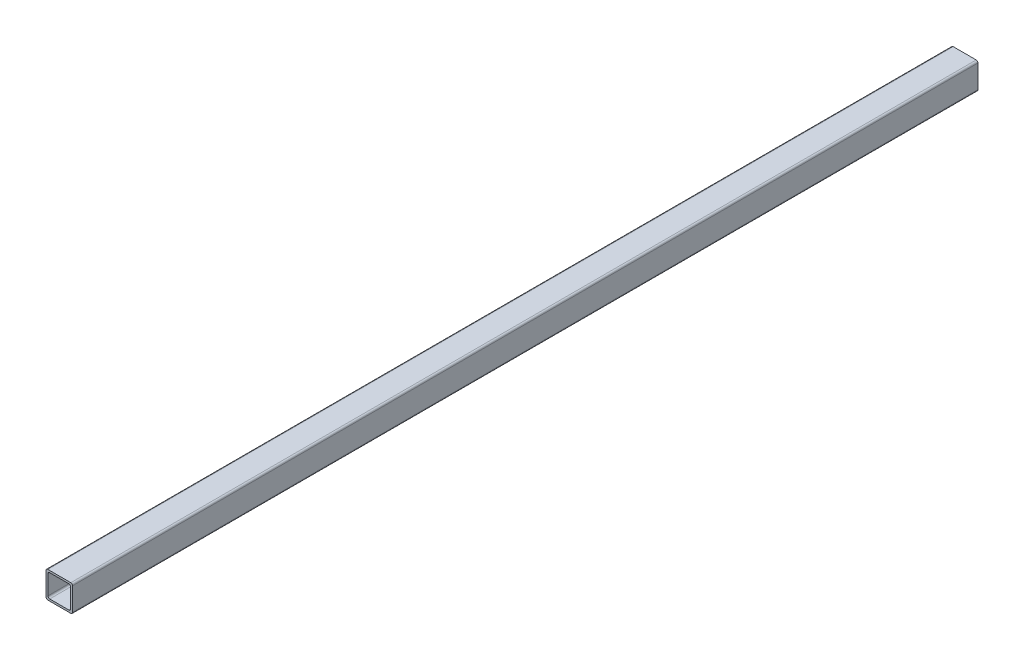
ISO-10303-21;
HEADER;
FILE_DESCRIPTION(('STEP AP214'),'2;1');
FILE_NAME('part.step','',(''),(''),'','','');
FILE_SCHEMA(('AUTOMOTIVE_DESIGN { 1 0 10303 214 1 1 1 1 }'));
ENDSEC;
DATA;
#1=APPLICATION_CONTEXT('core data for automotive mechanical design processes');
#2=APPLICATION_PROTOCOL_DEFINITION('international standard','automotive_design',2000,#1);
#3=PRODUCT_CONTEXT('',#1,'mechanical');
#4=PRODUCT('Part','Part','',(#3));
#5=PRODUCT_RELATED_PRODUCT_CATEGORY('part','',(#4));
#6=PRODUCT_DEFINITION_FORMATION('','',#4);
#7=PRODUCT_DEFINITION_CONTEXT('part definition',#1,'design');
#8=PRODUCT_DEFINITION('design','',#6,#7);
#9=PRODUCT_DEFINITION_SHAPE('','',#8);
#10=(LENGTH_UNIT() NAMED_UNIT(*) SI_UNIT(.MILLI.,.METRE.));
#11=(NAMED_UNIT(*) PLANE_ANGLE_UNIT() SI_UNIT($,.RADIAN.));
#12=(NAMED_UNIT(*) SI_UNIT($,.STERADIAN.) SOLID_ANGLE_UNIT());
#13=UNCERTAINTY_MEASURE_WITH_UNIT(LENGTH_MEASURE(1.E-05),#10,'distance_accuracy_value','');
#14=(GEOMETRIC_REPRESENTATION_CONTEXT(3) GLOBAL_UNCERTAINTY_ASSIGNED_CONTEXT((#13)) GLOBAL_UNIT_ASSIGNED_CONTEXT((#10,
#11,#12)) REPRESENTATION_CONTEXT('',''));
#15=CARTESIAN_POINT('',(0.,0.,0.));
#16=DIRECTION('',(0.,0.,1.));
#17=DIRECTION('',(1.,0.,0.));
#18=AXIS2_PLACEMENT_3D('',#15,#16,#17);
#19=CARTESIAN_POINT('',(2.54,-35.56,0.));
#20=DIRECTION('',(0.,0.,1.));
#21=DIRECTION('',(1.,0.,0.));
#22=AXIS2_PLACEMENT_3D('',#19,#20,#21);
#23=PLANE('',#22);
#24=CARTESIAN_POINT('',(2.54,-35.56,0.));
#25=DIRECTION('',(0.,0.,1.));
#26=DIRECTION('',(1.,0.,0.));
#27=AXIS2_PLACEMENT_3D('',#24,#25,#26);
#28=CIRCLE('',#27,2.54);
#29=CARTESIAN_POINT('',(0.,-35.56,0.));
#30=VERTEX_POINT('',#29);
#31=CARTESIAN_POINT('',(2.54000000000002,-38.1,0.));
#32=VERTEX_POINT('',#31);
#33=EDGE_CURVE('E194',#30,#32,#28,.T.);
#34=ORIENTED_EDGE('',*,*,#33,.F.);
#35=DIRECTION('',(0.,-1.,0.));
#36=VECTOR('',#35,1.);
#37=CARTESIAN_POINT('',(0.,-2.54000000000002,0.));
#38=LINE('',#37,#36);
#39=CARTESIAN_POINT('',(0.,-2.54000000000002,0.));
#40=VERTEX_POINT('',#39);
#41=EDGE_CURVE('E217',#40,#30,#38,.T.);
#42=ORIENTED_EDGE('',*,*,#41,.F.);
#43=CARTESIAN_POINT('',(2.54,-2.54,0.));
#44=DIRECTION('',(0.,0.,1.));
#45=DIRECTION('',(-1.,0.,0.));
#46=AXIS2_PLACEMENT_3D('',#43,#44,#45);
#47=CIRCLE('',#46,2.54);
#48=CARTESIAN_POINT('',(2.54000000000002,0.,0.));
#49=VERTEX_POINT('',#48);
#50=EDGE_CURVE('E214',#49,#40,#47,.T.);
#51=ORIENTED_EDGE('',*,*,#50,.F.);
#52=DIRECTION('',(-1.,0.,0.));
#53=VECTOR('',#52,1.);
#54=CARTESIAN_POINT('',(2.54000000000002,0.,0.));
#55=LINE('',#54,#53);
#56=CARTESIAN_POINT('',(35.56,0.,0.));
#57=VERTEX_POINT('',#56);
#58=EDGE_CURVE('E211',#57,#49,#55,.T.);
#59=ORIENTED_EDGE('',*,*,#58,.F.);
#60=CARTESIAN_POINT('',(35.56,-2.54,0.));
#61=DIRECTION('',(0.,0.,1.));
#62=DIRECTION('',(1.,0.,0.));
#63=AXIS2_PLACEMENT_3D('',#60,#61,#62);
#64=CIRCLE('',#63,2.54);
#65=CARTESIAN_POINT('',(38.1,-2.54000000000002,0.));
#66=VERTEX_POINT('',#65);
#67=EDGE_CURVE('E209',#66,#57,#64,.T.);
#68=ORIENTED_EDGE('',*,*,#67,.F.);
#69=DIRECTION('',(0.,1.,0.));
#70=VECTOR('',#69,1.);
#71=CARTESIAN_POINT('',(38.1,-2.54000000000002,0.));
#72=LINE('',#71,#70);
#73=CARTESIAN_POINT('',(38.1,-35.56,0.));
#74=VERTEX_POINT('',#73);
#75=EDGE_CURVE('E167',#74,#66,#72,.T.);
#76=ORIENTED_EDGE('',*,*,#75,.F.);
#77=CARTESIAN_POINT('',(35.56,-35.56,0.));
#78=DIRECTION('',(0.,0.,1.));
#79=DIRECTION('',(-1.,0.,0.));
#80=AXIS2_PLACEMENT_3D('',#77,#78,#79);
#81=CIRCLE('',#80,2.54);
#82=CARTESIAN_POINT('',(35.56,-38.1,0.));
#83=VERTEX_POINT('',#82);
#84=EDGE_CURVE('E196',#83,#74,#81,.T.);
#85=ORIENTED_EDGE('',*,*,#84,.F.);
#86=DIRECTION('',(1.,0.,0.));
#87=VECTOR('',#86,1.);
#88=CARTESIAN_POINT('',(2.54000000000002,-38.1,0.));
#89=LINE('',#88,#87);
#90=EDGE_CURVE('E184',#32,#83,#89,.T.);
#91=ORIENTED_EDGE('',*,*,#90,.F.);
#92=EDGE_LOOP('',(#34,#42,#51,#59,#68,#76,#85,#91));
#93=FACE_BOUND('',#92,.T.);
#94=CARTESIAN_POINT('',(5.3086,-32.7914,0.));
#95=DIRECTION('',(0.,0.,1.));
#96=DIRECTION('',(1.,0.,0.));
#97=AXIS2_PLACEMENT_3D('',#94,#95,#96);
#98=CIRCLE('',#97,2.54);
#99=CARTESIAN_POINT('',(2.7686,-32.7914,0.));
#100=VERTEX_POINT('',#99);
#101=CARTESIAN_POINT('',(5.30860000000002,-35.3314,0.));
#102=VERTEX_POINT('',#101);
#103=EDGE_CURVE('E242',#100,#102,#98,.T.);
#104=ORIENTED_EDGE('',*,*,#103,.T.);
#105=DIRECTION('',(1.,0.,0.));
#106=VECTOR('',#105,1.);
#107=CARTESIAN_POINT('',(5.30860000000002,-35.3314,0.));
#108=LINE('',#107,#106);
#109=CARTESIAN_POINT('',(32.7914,-35.3314,0.));
#110=VERTEX_POINT('',#109);
#111=EDGE_CURVE('E245',#102,#110,#108,.T.);
#112=ORIENTED_EDGE('',*,*,#111,.T.);
#113=CARTESIAN_POINT('',(32.7914,-32.7914,0.));
#114=DIRECTION('',(0.,0.,1.));
#115=DIRECTION('',(1.,0.,0.));
#116=AXIS2_PLACEMENT_3D('',#113,#114,#115);
#117=CIRCLE('',#116,2.54);
#118=CARTESIAN_POINT('',(35.3314,-32.7914,0.));
#119=VERTEX_POINT('',#118);
#120=EDGE_CURVE('E248',#110,#119,#117,.T.);
#121=ORIENTED_EDGE('',*,*,#120,.T.);
#122=DIRECTION('',(0.,1.,0.));
#123=VECTOR('',#122,1.);
#124=CARTESIAN_POINT('',(35.3314,-5.30860000000002,0.));
#125=LINE('',#124,#123);
#126=CARTESIAN_POINT('',(35.3314,-5.30860000000002,0.));
#127=VERTEX_POINT('',#126);
#128=EDGE_CURVE('E251',#119,#127,#125,.T.);
#129=ORIENTED_EDGE('',*,*,#128,.T.);
#130=CARTESIAN_POINT('',(32.7914,-5.3086,0.));
#131=DIRECTION('',(0.,0.,1.));
#132=DIRECTION('',(1.,0.,0.));
#133=AXIS2_PLACEMENT_3D('',#130,#131,#132);
#134=CIRCLE('',#133,2.54);
#135=CARTESIAN_POINT('',(32.7914,-2.7686,0.));
#136=VERTEX_POINT('',#135);
#137=EDGE_CURVE('E254',#127,#136,#134,.T.);
#138=ORIENTED_EDGE('',*,*,#137,.T.);
#139=DIRECTION('',(-1.,0.,0.));
#140=VECTOR('',#139,1.);
#141=CARTESIAN_POINT('',(5.30860000000002,-2.7686,0.));
#142=LINE('',#141,#140);
#143=CARTESIAN_POINT('',(5.30860000000002,-2.7686,0.));
#144=VERTEX_POINT('',#143);
#145=EDGE_CURVE('E257',#136,#144,#142,.T.);
#146=ORIENTED_EDGE('',*,*,#145,.T.);
#147=CARTESIAN_POINT('',(5.3086,-5.3086,0.));
#148=DIRECTION('',(0.,0.,1.));
#149=DIRECTION('',(1.,0.,0.));
#150=AXIS2_PLACEMENT_3D('',#147,#148,#149);
#151=CIRCLE('',#150,2.54);
#152=CARTESIAN_POINT('',(2.7686,-5.30860000000002,0.));
#153=VERTEX_POINT('',#152);
#154=EDGE_CURVE('E260',#144,#153,#151,.T.);
#155=ORIENTED_EDGE('',*,*,#154,.T.);
#156=DIRECTION('',(0.,-1.,0.));
#157=VECTOR('',#156,1.);
#158=CARTESIAN_POINT('',(2.7686,-5.30860000000002,0.));
#159=LINE('',#158,#157);
#160=EDGE_CURVE('E263',#153,#100,#159,.T.);
#161=ORIENTED_EDGE('',*,*,#160,.T.);
#162=EDGE_LOOP('',(#104,#112,#121,#129,#138,#146,#155,#161));
#163=FACE_BOUND('',#162,.T.);
#164=ADVANCED_FACE('F33',(#93,#163),#23,.F.);
#165=CARTESIAN_POINT('',(2.54,-35.56,1500.));
#166=DIRECTION('',(0.,0.,-1.));
#167=DIRECTION('',(-1.,0.,0.));
#168=AXIS2_PLACEMENT_3D('',#165,#166,#167);
#169=CYLINDRICAL_SURFACE('',#168,2.54);
#170=DIRECTION('',(0.,0.,-1.));
#171=VECTOR('',#170,1.);
#172=CARTESIAN_POINT('',(2.54000000000002,-38.1,1500.));
#173=LINE('',#172,#171);
#174=CARTESIAN_POINT('',(2.54000000000002,-38.1,1296.93567774538));
#175=VERTEX_POINT('',#174);
#176=EDGE_CURVE('E41',#175,#32,#173,.T.);
#177=ORIENTED_EDGE('',*,*,#176,.F.);
#178=CARTESIAN_POINT('',(2.54,-35.56,1296.93567774538));
#179=DIRECTION('',(0.,0.,-1.));
#180=DIRECTION('',(0.,1.,0.));
#181=AXIS2_PLACEMENT_3D('',#178,#179,#180);
#182=CIRCLE('',#181,2.54);
#183=CARTESIAN_POINT('',(0.,-35.56,1296.93567774538));
#184=VERTEX_POINT('',#183);
#185=EDGE_CURVE('E162',#175,#184,#182,.T.);
#186=ORIENTED_EDGE('',*,*,#185,.T.);
#187=DIRECTION('',(0.,0.,-1.));
#188=VECTOR('',#187,1.);
#189=CARTESIAN_POINT('',(0.,-35.56,1500.));
#190=LINE('',#189,#188);
#191=EDGE_CURVE('E199',#184,#30,#190,.T.);
#192=ORIENTED_EDGE('',*,*,#191,.T.);
#193=ORIENTED_EDGE('',*,*,#33,.T.);
#194=EDGE_LOOP('',(#177,#186,#192,#193));
#195=FACE_BOUND('',#194,.T.);
#196=ADVANCED_FACE('F35',(#195),#169,.T.);
#197=CARTESIAN_POINT('',(2.54000000000002,-38.1,1500.));
#198=DIRECTION('',(0.,1.,0.));
#199=DIRECTION('',(0.,0.,1.));
#200=AXIS2_PLACEMENT_3D('',#197,#198,#199);
#201=PLANE('',#200);
#202=DIRECTION('',(0.,0.,-1.));
#203=VECTOR('',#202,1.);
#204=CARTESIAN_POINT('',(35.56,-38.1,1500.));
#205=LINE('',#204,#203);
#206=CARTESIAN_POINT('',(35.56,-38.1,1296.93567774538));
#207=VERTEX_POINT('',#206);
#208=EDGE_CURVE('E171',#207,#83,#205,.T.);
#209=ORIENTED_EDGE('',*,*,#208,.F.);
#210=DIRECTION('',(-1.,0.,0.));
#211=VECTOR('',#210,1.);
#212=CARTESIAN_POINT('',(2.54000000000002,-38.1,1296.93567774538));
#213=LINE('',#212,#211);
#214=EDGE_CURVE('E186',#207,#175,#213,.T.);
#215=ORIENTED_EDGE('',*,*,#214,.T.);
#216=ORIENTED_EDGE('',*,*,#176,.T.);
#217=ORIENTED_EDGE('',*,*,#90,.T.);
#218=EDGE_LOOP('',(#209,#215,#216,#217));
#219=FACE_BOUND('',#218,.T.);
#220=ADVANCED_FACE('F183',(#219),#201,.F.);
#221=CARTESIAN_POINT('',(35.56,-35.56,1500.));
#222=DIRECTION('',(0.,0.,-1.));
#223=DIRECTION('',(-1.,0.,0.));
#224=AXIS2_PLACEMENT_3D('',#221,#222,#223);
#225=CYLINDRICAL_SURFACE('',#224,2.54);
#226=DIRECTION('',(0.,0.,-1.));
#227=VECTOR('',#226,1.);
#228=CARTESIAN_POINT('',(38.1,-35.56,1500.));
#229=LINE('',#228,#227);
#230=CARTESIAN_POINT('',(38.1,-35.56,1296.93567774538));
#231=VERTEX_POINT('',#230);
#232=EDGE_CURVE('E169',#231,#74,#229,.T.);
#233=ORIENTED_EDGE('',*,*,#232,.F.);
#234=CARTESIAN_POINT('',(35.56,-35.56,1296.93567774538));
#235=DIRECTION('',(0.,0.,-1.));
#236=DIRECTION('',(0.,1.,0.));
#237=AXIS2_PLACEMENT_3D('',#234,#235,#236);
#238=CIRCLE('',#237,2.54);
#239=EDGE_CURVE('E149',#231,#207,#238,.T.);
#240=ORIENTED_EDGE('',*,*,#239,.T.);
#241=ORIENTED_EDGE('',*,*,#208,.T.);
#242=ORIENTED_EDGE('',*,*,#84,.T.);
#243=EDGE_LOOP('',(#233,#240,#241,#242));
#244=FACE_BOUND('',#243,.T.);
#245=ADVANCED_FACE('F351',(#244),#225,.T.);
#246=CARTESIAN_POINT('',(38.1,-2.54000000000002,1500.));
#247=DIRECTION('',(-1.,0.,0.));
#248=DIRECTION('',(0.,-1.,0.));
#249=AXIS2_PLACEMENT_3D('',#246,#247,#248);
#250=PLANE('',#249);
#251=DIRECTION('',(0.,0.,-1.));
#252=VECTOR('',#251,1.);
#253=CARTESIAN_POINT('',(38.1,-2.54000000000002,1500.));
#254=LINE('',#253,#252);
#255=CARTESIAN_POINT('',(38.1,-2.53999999999999,1296.93567774538));
#256=VERTEX_POINT('',#255);
#257=EDGE_CURVE('E159',#256,#66,#254,.T.);
#258=ORIENTED_EDGE('',*,*,#257,.F.);
#259=DIRECTION('',(0.,-1.,0.));
#260=VECTOR('',#259,1.);
#261=CARTESIAN_POINT('',(38.0999999999999,791.741511996223,1296.93567774538));
#262=LINE('',#261,#260);
#263=EDGE_CURVE('E143',#256,#231,#262,.T.);
#264=ORIENTED_EDGE('',*,*,#263,.T.);
#265=ORIENTED_EDGE('',*,*,#232,.T.);
#266=ORIENTED_EDGE('',*,*,#75,.T.);
#267=EDGE_LOOP('',(#258,#264,#265,#266));
#268=FACE_BOUND('',#267,.T.);
#269=ADVANCED_FACE('F165',(#268),#250,.F.);
#270=CARTESIAN_POINT('',(35.56,-2.54,1500.));
#271=DIRECTION('',(0.,0.,-1.));
#272=DIRECTION('',(-1.,0.,0.));
#273=AXIS2_PLACEMENT_3D('',#270,#271,#272);
#274=CYLINDRICAL_SURFACE('',#273,2.54);
#275=DIRECTION('',(0.,0.,-1.));
#276=VECTOR('',#275,1.);
#277=CARTESIAN_POINT('',(35.56,0.,1500.));
#278=LINE('',#277,#276);
#279=CARTESIAN_POINT('',(35.56,0.,1296.93567774538));
#280=VERTEX_POINT('',#279);
#281=EDGE_CURVE('E161',#280,#57,#278,.T.);
#282=ORIENTED_EDGE('',*,*,#281,.F.);
#283=CARTESIAN_POINT('',(35.56,-2.54,1296.93567774538));
#284=DIRECTION('',(0.,0.,-1.));
#285=DIRECTION('',(0.,1.,0.));
#286=AXIS2_PLACEMENT_3D('',#283,#284,#285);
#287=CIRCLE('',#286,2.54);
#288=EDGE_CURVE('E146',#280,#256,#287,.T.);
#289=ORIENTED_EDGE('',*,*,#288,.T.);
#290=ORIENTED_EDGE('',*,*,#257,.T.);
#291=ORIENTED_EDGE('',*,*,#67,.T.);
#292=EDGE_LOOP('',(#282,#289,#290,#291));
#293=FACE_BOUND('',#292,.T.);
#294=ADVANCED_FACE('F157',(#293),#274,.T.);
#295=CARTESIAN_POINT('',(2.54000000000002,0.,1500.));
#296=DIRECTION('',(0.,-1.,0.));
#297=DIRECTION('',(0.,0.,-1.));
#298=AXIS2_PLACEMENT_3D('',#295,#296,#297);
#299=PLANE('',#298);
#300=DIRECTION('',(0.,0.,-1.));
#301=VECTOR('',#300,1.);
#302=CARTESIAN_POINT('',(2.54000000000002,0.,1500.));
#303=LINE('',#302,#301);
#304=CARTESIAN_POINT('',(2.54,0.,1296.93567774538));
#305=VERTEX_POINT('',#304);
#306=EDGE_CURVE('E173',#305,#49,#303,.T.);
#307=ORIENTED_EDGE('',*,*,#306,.F.);
#308=DIRECTION('',(1.,0.,0.));
#309=VECTOR('',#308,1.);
#310=CARTESIAN_POINT('',(2.54000000000002,0.,1296.93567774538));
#311=LINE('',#310,#309);
#312=EDGE_CURVE('E163',#305,#280,#311,.T.);
#313=ORIENTED_EDGE('',*,*,#312,.T.);
#314=ORIENTED_EDGE('',*,*,#281,.T.);
#315=ORIENTED_EDGE('',*,*,#58,.T.);
#316=EDGE_LOOP('',(#307,#313,#314,#315));
#317=FACE_BOUND('',#316,.T.);
#318=ADVANCED_FACE('F228',(#317),#299,.F.);
#319=CARTESIAN_POINT('',(2.54,-2.54,1500.));
#320=DIRECTION('',(0.,0.,-1.));
#321=DIRECTION('',(-1.,0.,0.));
#322=AXIS2_PLACEMENT_3D('',#319,#320,#321);
#323=CYLINDRICAL_SURFACE('',#322,2.54);
#324=DIRECTION('',(0.,0.,-1.));
#325=VECTOR('',#324,1.);
#326=CARTESIAN_POINT('',(0.,-2.54000000000002,1500.));
#327=LINE('',#326,#325);
#328=CARTESIAN_POINT('',(0.,-2.54000000000002,1296.93567774538));
#329=VERTEX_POINT('',#328);
#330=EDGE_CURVE('E220',#329,#40,#327,.T.);
#331=ORIENTED_EDGE('',*,*,#330,.F.);
#332=CARTESIAN_POINT('',(2.54,-2.54,1296.93567774538));
#333=DIRECTION('',(0.,0.,-1.));
#334=DIRECTION('',(0.,1.,0.));
#335=AXIS2_PLACEMENT_3D('',#332,#333,#334);
#336=CIRCLE('',#335,2.54);
#337=EDGE_CURVE('E48',#329,#305,#336,.T.);
#338=ORIENTED_EDGE('',*,*,#337,.T.);
#339=ORIENTED_EDGE('',*,*,#306,.T.);
#340=ORIENTED_EDGE('',*,*,#50,.T.);
#341=EDGE_LOOP('',(#331,#338,#339,#340));
#342=FACE_BOUND('',#341,.T.);
#343=ADVANCED_FACE('F224',(#342),#323,.T.);
#344=CARTESIAN_POINT('',(0.,-2.54000000000002,1500.));
#345=DIRECTION('',(1.,0.,0.));
#346=DIRECTION('',(0.,1.,0.));
#347=AXIS2_PLACEMENT_3D('',#344,#345,#346);
#348=PLANE('',#347);
#349=ORIENTED_EDGE('',*,*,#191,.F.);
#350=DIRECTION('',(0.,1.,0.));
#351=VECTOR('',#350,1.);
#352=CARTESIAN_POINT('',(0.,-2.54000000000004,1296.93567774538));
#353=LINE('',#352,#351);
#354=EDGE_CURVE('E231',#184,#329,#353,.T.);
#355=ORIENTED_EDGE('',*,*,#354,.T.);
#356=ORIENTED_EDGE('',*,*,#330,.T.);
#357=ORIENTED_EDGE('',*,*,#41,.T.);
#358=EDGE_LOOP('',(#349,#355,#356,#357));
#359=FACE_BOUND('',#358,.T.);
#360=ADVANCED_FACE('F230',(#359),#348,.F.);
#361=CARTESIAN_POINT('',(5.3086,-32.7914,1500.));
#362=DIRECTION('',(0.,0.,-1.));
#363=DIRECTION('',(-1.,0.,0.));
#364=AXIS2_PLACEMENT_3D('',#361,#362,#363);
#365=CYLINDRICAL_SURFACE('',#364,2.54);
#366=CARTESIAN_POINT('',(5.3086,-32.7914,1296.93567774538));
#367=DIRECTION('',(0.,0.,-1.));
#368=DIRECTION('',(0.,1.,0.));
#369=AXIS2_PLACEMENT_3D('',#366,#367,#368);
#370=CIRCLE('',#369,2.54);
#371=CARTESIAN_POINT('',(5.30860000000002,-35.3314,1296.93567774538));
#372=VERTEX_POINT('',#371);
#373=CARTESIAN_POINT('',(2.7686,-32.7914,1296.93567774538));
#374=VERTEX_POINT('',#373);
#375=EDGE_CURVE('E55',#372,#374,#370,.T.);
#376=ORIENTED_EDGE('',*,*,#375,.F.);
#377=DIRECTION('',(0.,0.,-1.));
#378=VECTOR('',#377,1.);
#379=CARTESIAN_POINT('',(5.30860000000002,-35.3314,1500.));
#380=LINE('',#379,#378);
#381=EDGE_CURVE('E201',#372,#102,#380,.T.);
#382=ORIENTED_EDGE('',*,*,#381,.T.);
#383=ORIENTED_EDGE('',*,*,#103,.F.);
#384=DIRECTION('',(0.,0.,-1.));
#385=VECTOR('',#384,1.);
#386=CARTESIAN_POINT('',(2.7686,-32.7914,1500.));
#387=LINE('',#386,#385);
#388=EDGE_CURVE('E266',#374,#100,#387,.T.);
#389=ORIENTED_EDGE('',*,*,#388,.F.);
#390=EDGE_LOOP('',(#376,#382,#383,#389));
#391=FACE_BOUND('',#390,.T.);
#392=ADVANCED_FACE('F293',(#391),#365,.F.);
#393=CARTESIAN_POINT('',(5.30860000000002,-35.3314,1500.));
#394=DIRECTION('',(0.,1.,0.));
#395=DIRECTION('',(0.,0.,1.));
#396=AXIS2_PLACEMENT_3D('',#393,#394,#395);
#397=PLANE('',#396);
#398=DIRECTION('',(-1.,0.,0.));
#399=VECTOR('',#398,1.);
#400=CARTESIAN_POINT('',(5.30860000000002,-35.3314,1296.93567774538));
#401=LINE('',#400,#399);
#402=CARTESIAN_POINT('',(32.7914,-35.3314,1296.93567774538));
#403=VERTEX_POINT('',#402);
#404=EDGE_CURVE('E234',#403,#372,#401,.T.);
#405=ORIENTED_EDGE('',*,*,#404,.F.);
#406=DIRECTION('',(0.,0.,-1.));
#407=VECTOR('',#406,1.);
#408=CARTESIAN_POINT('',(32.7914,-35.3314,1500.));
#409=LINE('',#408,#407);
#410=EDGE_CURVE('E203',#403,#110,#409,.T.);
#411=ORIENTED_EDGE('',*,*,#410,.T.);
#412=ORIENTED_EDGE('',*,*,#111,.F.);
#413=ORIENTED_EDGE('',*,*,#381,.F.);
#414=EDGE_LOOP('',(#405,#411,#412,#413));
#415=FACE_BOUND('',#414,.T.);
#416=ADVANCED_FACE('F282',(#415),#397,.T.);
#417=CARTESIAN_POINT('',(32.7914,-32.7914,1500.));
#418=DIRECTION('',(0.,0.,-1.));
#419=DIRECTION('',(-1.,0.,0.));
#420=AXIS2_PLACEMENT_3D('',#417,#418,#419);
#421=CYLINDRICAL_SURFACE('',#420,2.54);
#422=CARTESIAN_POINT('',(32.7914,-32.7914,1296.93567774538));
#423=DIRECTION('',(0.,0.,-1.));
#424=DIRECTION('',(0.,1.,0.));
#425=AXIS2_PLACEMENT_3D('',#422,#423,#424);
#426=CIRCLE('',#425,2.54);
#427=CARTESIAN_POINT('',(35.3314,-32.7914,1296.93567774538));
#428=VERTEX_POINT('',#427);
#429=EDGE_CURVE('E311',#428,#403,#426,.T.);
#430=ORIENTED_EDGE('',*,*,#429,.F.);
#431=DIRECTION('',(0.,0.,-1.));
#432=VECTOR('',#431,1.);
#433=CARTESIAN_POINT('',(35.3314,-32.7914,1500.));
#434=LINE('',#433,#432);
#435=EDGE_CURVE('E276',#428,#119,#434,.T.);
#436=ORIENTED_EDGE('',*,*,#435,.T.);
#437=ORIENTED_EDGE('',*,*,#120,.F.);
#438=ORIENTED_EDGE('',*,*,#410,.F.);
#439=EDGE_LOOP('',(#430,#436,#437,#438));
#440=FACE_BOUND('',#439,.T.);
#441=ADVANCED_FACE('F286',(#440),#421,.F.);
#442=CARTESIAN_POINT('',(35.3314,-5.30860000000002,1500.));
#443=DIRECTION('',(-1.,0.,0.));
#444=DIRECTION('',(0.,0.,1.));
#445=AXIS2_PLACEMENT_3D('',#442,#443,#444);
#446=PLANE('',#445);
#447=DIRECTION('',(0.,-1.,0.));
#448=VECTOR('',#447,1.);
#449=CARTESIAN_POINT('',(35.3314,-5.30860000000004,1296.93567774538));
#450=LINE('',#449,#448);
#451=CARTESIAN_POINT('',(35.3314,-5.30860000000002,1296.93567774538));
#452=VERTEX_POINT('',#451);
#453=EDGE_CURVE('E309',#452,#428,#450,.T.);
#454=ORIENTED_EDGE('',*,*,#453,.F.);
#455=DIRECTION('',(0.,0.,-1.));
#456=VECTOR('',#455,1.);
#457=CARTESIAN_POINT('',(35.3314,-5.30860000000002,1500.));
#458=LINE('',#457,#456);
#459=EDGE_CURVE('E274',#452,#127,#458,.T.);
#460=ORIENTED_EDGE('',*,*,#459,.T.);
#461=ORIENTED_EDGE('',*,*,#128,.F.);
#462=ORIENTED_EDGE('',*,*,#435,.F.);
#463=EDGE_LOOP('',(#454,#460,#461,#462));
#464=FACE_BOUND('',#463,.T.);
#465=ADVANCED_FACE('F314',(#464),#446,.T.);
#466=CARTESIAN_POINT('',(32.7914,-5.3086,1500.));
#467=DIRECTION('',(0.,0.,-1.));
#468=DIRECTION('',(-1.,0.,0.));
#469=AXIS2_PLACEMENT_3D('',#466,#467,#468);
#470=CYLINDRICAL_SURFACE('',#469,2.54);
#471=CARTESIAN_POINT('',(32.7914,-5.3086,1296.93567774538));
#472=DIRECTION('',(0.,0.,-1.));
#473=DIRECTION('',(0.,1.,0.));
#474=AXIS2_PLACEMENT_3D('',#471,#472,#473);
#475=CIRCLE('',#474,2.54);
#476=CARTESIAN_POINT('',(32.7914,-2.7686,1296.93567774538));
#477=VERTEX_POINT('',#476);
#478=EDGE_CURVE('E305',#477,#452,#475,.T.);
#479=ORIENTED_EDGE('',*,*,#478,.F.);
#480=DIRECTION('',(0.,0.,-1.));
#481=VECTOR('',#480,1.);
#482=CARTESIAN_POINT('',(32.7914,-2.7686,1500.));
#483=LINE('',#482,#481);
#484=EDGE_CURVE('E272',#477,#136,#483,.T.);
#485=ORIENTED_EDGE('',*,*,#484,.T.);
#486=ORIENTED_EDGE('',*,*,#137,.F.);
#487=ORIENTED_EDGE('',*,*,#459,.F.);
#488=EDGE_LOOP('',(#479,#485,#486,#487));
#489=FACE_BOUND('',#488,.T.);
#490=ADVANCED_FACE('F320',(#489),#470,.F.);
#491=CARTESIAN_POINT('',(5.30860000000002,-2.7686,1500.));
#492=DIRECTION('',(0.,-1.,0.));
#493=DIRECTION('',(0.,0.,-1.));
#494=AXIS2_PLACEMENT_3D('',#491,#492,#493);
#495=PLANE('',#494);
#496=DIRECTION('',(1.,0.,0.));
#497=VECTOR('',#496,1.);
#498=CARTESIAN_POINT('',(5.30860000000002,-2.7686,1296.93567774538));
#499=LINE('',#498,#497);
#500=CARTESIAN_POINT('',(5.3086,-2.7686,1296.93567774538));
#501=VERTEX_POINT('',#500);
#502=EDGE_CURVE('E303',#501,#477,#499,.T.);
#503=ORIENTED_EDGE('',*,*,#502,.F.);
#504=DIRECTION('',(0.,0.,-1.));
#505=VECTOR('',#504,1.);
#506=CARTESIAN_POINT('',(5.30860000000002,-2.7686,1500.));
#507=LINE('',#506,#505);
#508=EDGE_CURVE('E270',#501,#144,#507,.T.);
#509=ORIENTED_EDGE('',*,*,#508,.T.);
#510=ORIENTED_EDGE('',*,*,#145,.F.);
#511=ORIENTED_EDGE('',*,*,#484,.F.);
#512=EDGE_LOOP('',(#503,#509,#510,#511));
#513=FACE_BOUND('',#512,.T.);
#514=ADVANCED_FACE('F323',(#513),#495,.T.);
#515=CARTESIAN_POINT('',(5.3086,-5.3086,1500.));
#516=DIRECTION('',(0.,0.,-1.));
#517=DIRECTION('',(-1.,0.,0.));
#518=AXIS2_PLACEMENT_3D('',#515,#516,#517);
#519=CYLINDRICAL_SURFACE('',#518,2.54);
#520=CARTESIAN_POINT('',(5.3086,-5.3086,1296.93567774538));
#521=DIRECTION('',(0.,0.,-1.));
#522=DIRECTION('',(0.,1.,0.));
#523=AXIS2_PLACEMENT_3D('',#520,#521,#522);
#524=CIRCLE('',#523,2.54);
#525=CARTESIAN_POINT('',(2.7686,-5.30860000000002,1296.93567774538));
#526=VERTEX_POINT('',#525);
#527=EDGE_CURVE('E153',#526,#501,#524,.T.);
#528=ORIENTED_EDGE('',*,*,#527,.F.);
#529=DIRECTION('',(0.,0.,-1.));
#530=VECTOR('',#529,1.);
#531=CARTESIAN_POINT('',(2.7686,-5.30860000000002,1500.));
#532=LINE('',#531,#530);
#533=EDGE_CURVE('E268',#526,#153,#532,.T.);
#534=ORIENTED_EDGE('',*,*,#533,.T.);
#535=ORIENTED_EDGE('',*,*,#154,.F.);
#536=ORIENTED_EDGE('',*,*,#508,.F.);
#537=EDGE_LOOP('',(#528,#534,#535,#536));
#538=FACE_BOUND('',#537,.T.);
#539=ADVANCED_FACE('F301',(#538),#519,.F.);
#540=CARTESIAN_POINT('',(2.7686,-5.30860000000002,1500.));
#541=DIRECTION('',(1.,0.,0.));
#542=DIRECTION('',(0.,0.,-1.));
#543=AXIS2_PLACEMENT_3D('',#540,#541,#542);
#544=PLANE('',#543);
#545=DIRECTION('',(0.,1.,0.));
#546=VECTOR('',#545,1.);
#547=CARTESIAN_POINT('',(2.7686,-5.30860000000004,1296.93567774538));
#548=LINE('',#547,#546);
#549=EDGE_CURVE('E11',#374,#526,#548,.T.);
#550=ORIENTED_EDGE('',*,*,#549,.F.);
#551=ORIENTED_EDGE('',*,*,#388,.T.);
#552=ORIENTED_EDGE('',*,*,#160,.F.);
#553=ORIENTED_EDGE('',*,*,#533,.F.);
#554=EDGE_LOOP('',(#550,#551,#552,#553));
#555=FACE_BOUND('',#554,.T.);
#556=ADVANCED_FACE('F295',(#555),#544,.T.);
#557=CARTESIAN_POINT('',(38.0999999999999,791.741511996223,1296.93567774538));
#558=DIRECTION('',(0.,0.,-1.));
#559=DIRECTION('',(0.,1.,0.));
#560=AXIS2_PLACEMENT_3D('',#557,#558,#559);
#561=PLANE('',#560);
#562=ORIENTED_EDGE('',*,*,#375,.T.);
#563=ORIENTED_EDGE('',*,*,#549,.T.);
#564=ORIENTED_EDGE('',*,*,#527,.T.);
#565=ORIENTED_EDGE('',*,*,#502,.T.);
#566=ORIENTED_EDGE('',*,*,#478,.T.);
#567=ORIENTED_EDGE('',*,*,#453,.T.);
#568=ORIENTED_EDGE('',*,*,#429,.T.);
#569=ORIENTED_EDGE('',*,*,#404,.T.);
#570=EDGE_LOOP('',(#562,#563,#564,#565,#566,#567,#568,#569));
#571=FACE_BOUND('',#570,.T.);
#572=ORIENTED_EDGE('',*,*,#263,.F.);
#573=ORIENTED_EDGE('',*,*,#288,.F.);
#574=ORIENTED_EDGE('',*,*,#312,.F.);
#575=ORIENTED_EDGE('',*,*,#337,.F.);
#576=ORIENTED_EDGE('',*,*,#354,.F.);
#577=ORIENTED_EDGE('',*,*,#185,.F.);
#578=ORIENTED_EDGE('',*,*,#214,.F.);
#579=ORIENTED_EDGE('',*,*,#239,.F.);
#580=EDGE_LOOP('',(#572,#573,#574,#575,#576,#577,#578,#579));
#581=FACE_BOUND('',#580,.T.);
#582=ADVANCED_FACE('F145',(#571,#581),#561,.F.);
#583=CLOSED_SHELL('',(#164,#196,#220,#245,#269,#294,#318,#343,#360,#392,#416,#441,#465,#490,
#514,#539,#556,#582));
#584=MANIFOLD_SOLID_BREP('B2',#583);
#585=ADVANCED_BREP_SHAPE_REPRESENTATION('',(#18,#584),#14);
#586=SHAPE_DEFINITION_REPRESENTATION(#9,#585);
ENDSEC;
END-ISO-10303-21;
